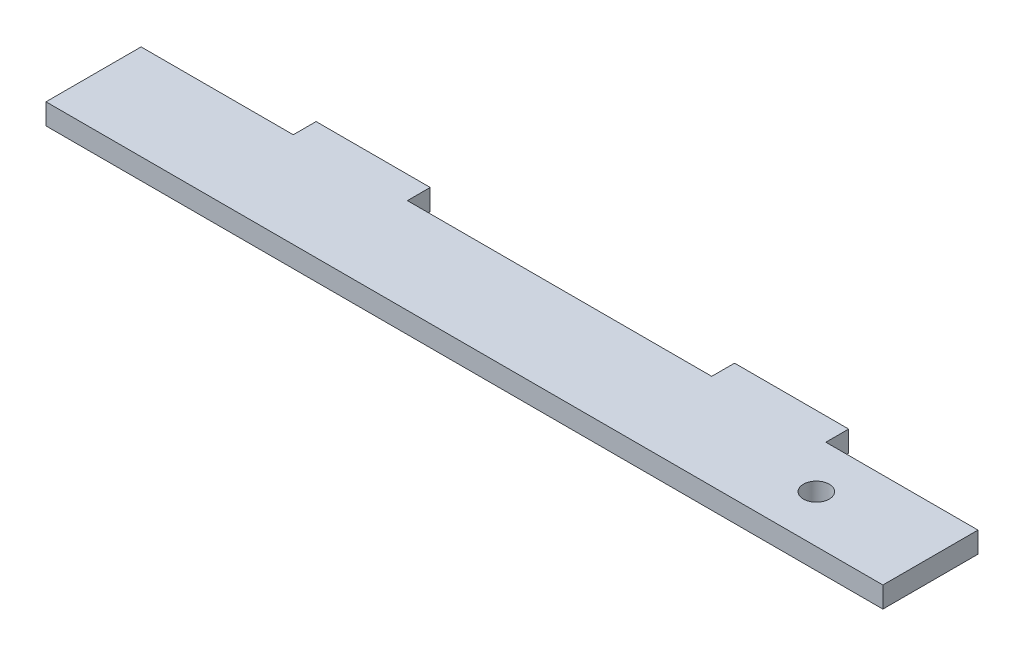
ISO-10303-21;
HEADER;
FILE_DESCRIPTION(('STEP AP214'),'2;1');
FILE_NAME('part.step','',(''),(''),'','','');
FILE_SCHEMA(('AUTOMOTIVE_DESIGN { 1 0 10303 214 1 1 1 1 }'));
ENDSEC;
DATA;
#1=APPLICATION_CONTEXT('core data for automotive mechanical design processes');
#2=APPLICATION_PROTOCOL_DEFINITION('international standard','automotive_design',2000,#1);
#3=PRODUCT_CONTEXT('',#1,'mechanical');
#4=PRODUCT('Part','Part','',(#3));
#5=PRODUCT_RELATED_PRODUCT_CATEGORY('part','',(#4));
#6=PRODUCT_DEFINITION_FORMATION('','',#4);
#7=PRODUCT_DEFINITION_CONTEXT('part definition',#1,'design');
#8=PRODUCT_DEFINITION('design','',#6,#7);
#9=PRODUCT_DEFINITION_SHAPE('','',#8);
#10=(LENGTH_UNIT() NAMED_UNIT(*) SI_UNIT(.MILLI.,.METRE.));
#11=(NAMED_UNIT(*) PLANE_ANGLE_UNIT() SI_UNIT($,.RADIAN.));
#12=(NAMED_UNIT(*) SI_UNIT($,.STERADIAN.) SOLID_ANGLE_UNIT());
#13=UNCERTAINTY_MEASURE_WITH_UNIT(LENGTH_MEASURE(1.E-05),#10,'distance_accuracy_value','');
#14=(GEOMETRIC_REPRESENTATION_CONTEXT(3) GLOBAL_UNCERTAINTY_ASSIGNED_CONTEXT((#13)) GLOBAL_UNIT_ASSIGNED_CONTEXT((#10,
#11,#12)) REPRESENTATION_CONTEXT('',''));
#15=CARTESIAN_POINT('',(0.,0.,0.));
#16=DIRECTION('',(0.,0.,1.));
#17=DIRECTION('',(1.,0.,0.));
#18=AXIS2_PLACEMENT_3D('',#15,#16,#17);
#19=CARTESIAN_POINT('',(-70.,5.5,0.));
#20=DIRECTION('',(-1.,0.,0.));
#21=DIRECTION('',(0.,0.,1.));
#22=AXIS2_PLACEMENT_3D('',#19,#20,#21);
#23=PLANE('',#22);
#24=DIRECTION('',(0.,0.,-1.));
#25=VECTOR('',#24,1.);
#26=CARTESIAN_POINT('',(-70.,0.,0.));
#27=LINE('',#26,#25);
#28=CARTESIAN_POINT('',(-70.,0.,-12.5000000000001));
#29=VERTEX_POINT('',#28);
#30=CARTESIAN_POINT('',(-70.,0.,-18.5000000000001));
#31=VERTEX_POINT('',#30);
#32=EDGE_CURVE('E189',#29,#31,#27,.T.);
#33=ORIENTED_EDGE('',*,*,#32,.F.);
#34=DIRECTION('',(0.,-1.,0.));
#35=VECTOR('',#34,1.);
#36=CARTESIAN_POINT('',(-70.,5.5,-12.5000000000001));
#37=LINE('',#36,#35);
#38=CARTESIAN_POINT('',(-70.,5.5,-12.5000000000001));
#39=VERTEX_POINT('',#38);
#40=EDGE_CURVE('E11',#39,#29,#37,.T.);
#41=ORIENTED_EDGE('',*,*,#40,.F.);
#42=DIRECTION('',(0.,0.,-1.));
#43=VECTOR('',#42,1.);
#44=CARTESIAN_POINT('',(-70.,5.5,0.));
#45=LINE('',#44,#43);
#46=CARTESIAN_POINT('',(-70.,5.5,-18.5000000000001));
#47=VERTEX_POINT('',#46);
#48=EDGE_CURVE('E169',#39,#47,#45,.T.);
#49=ORIENTED_EDGE('',*,*,#48,.T.);
#50=DIRECTION('',(0.,-1.,0.));
#51=VECTOR('',#50,1.);
#52=CARTESIAN_POINT('',(-70.,5.5,-18.5000000000001));
#53=LINE('',#52,#51);
#54=EDGE_CURVE('E55',#47,#31,#53,.T.);
#55=ORIENTED_EDGE('',*,*,#54,.T.);
#56=EDGE_LOOP('',(#33,#41,#49,#55));
#57=FACE_BOUND('',#56,.T.);
#58=ADVANCED_FACE('F38',(#57),#23,.T.);
#59=CARTESIAN_POINT('',(0.,5.5,-12.5000000000001));
#60=DIRECTION('',(0.,0.,-1.));
#61=DIRECTION('',(-1.,0.,0.));
#62=AXIS2_PLACEMENT_3D('',#59,#60,#61);
#63=PLANE('',#62);
#64=DIRECTION('',(1.,0.,0.));
#65=VECTOR('',#64,1.);
#66=CARTESIAN_POINT('',(0.,0.,-12.5000000000001));
#67=LINE('',#66,#65);
#68=CARTESIAN_POINT('',(-110.,0.,-12.5000000000001));
#69=VERTEX_POINT('',#68);
#70=EDGE_CURVE('E193',#69,#29,#67,.T.);
#71=ORIENTED_EDGE('',*,*,#70,.F.);
#72=DIRECTION('',(0.,-1.,0.));
#73=VECTOR('',#72,1.);
#74=CARTESIAN_POINT('',(-110.,5.5,-12.5000000000001));
#75=LINE('',#74,#73);
#76=CARTESIAN_POINT('',(-110.,5.5,-12.5000000000001));
#77=VERTEX_POINT('',#76);
#78=EDGE_CURVE('E47',#77,#69,#75,.T.);
#79=ORIENTED_EDGE('',*,*,#78,.F.);
#80=DIRECTION('',(1.,0.,0.));
#81=VECTOR('',#80,1.);
#82=CARTESIAN_POINT('',(0.,5.5,-12.5000000000001));
#83=LINE('',#82,#81);
#84=EDGE_CURVE('E156',#77,#39,#83,.T.);
#85=ORIENTED_EDGE('',*,*,#84,.T.);
#86=ORIENTED_EDGE('',*,*,#40,.T.);
#87=EDGE_LOOP('',(#71,#79,#85,#86));
#88=FACE_BOUND('',#87,.T.);
#89=ADVANCED_FACE('F257',(#88),#63,.T.);
#90=CARTESIAN_POINT('',(-110.,5.5,0.));
#91=DIRECTION('',(-1.,0.,0.));
#92=DIRECTION('',(0.,0.,1.));
#93=AXIS2_PLACEMENT_3D('',#90,#91,#92);
#94=PLANE('',#93);
#95=DIRECTION('',(0.,0.,-1.));
#96=VECTOR('',#95,1.);
#97=CARTESIAN_POINT('',(-110.,0.,0.));
#98=LINE('',#97,#96);
#99=CARTESIAN_POINT('',(-110.,0.,12.4999999999999));
#100=VERTEX_POINT('',#99);
#101=EDGE_CURVE('E198',#100,#69,#98,.T.);
#102=ORIENTED_EDGE('',*,*,#101,.F.);
#103=DIRECTION('',(0.,-1.,0.));
#104=VECTOR('',#103,1.);
#105=CARTESIAN_POINT('',(-110.,5.5,12.4999999999999));
#106=LINE('',#105,#104);
#107=CARTESIAN_POINT('',(-110.,5.5,12.4999999999999));
#108=VERTEX_POINT('',#107);
#109=EDGE_CURVE('E249',#108,#100,#106,.T.);
#110=ORIENTED_EDGE('',*,*,#109,.F.);
#111=DIRECTION('',(0.,0.,-1.));
#112=VECTOR('',#111,1.);
#113=CARTESIAN_POINT('',(-110.,5.5,0.));
#114=LINE('',#113,#112);
#115=EDGE_CURVE('E168',#108,#77,#114,.T.);
#116=ORIENTED_EDGE('',*,*,#115,.T.);
#117=ORIENTED_EDGE('',*,*,#78,.T.);
#118=EDGE_LOOP('',(#102,#110,#116,#117));
#119=FACE_BOUND('',#118,.T.);
#120=ADVANCED_FACE('F255',(#119),#94,.T.);
#121=CARTESIAN_POINT('',(0.,5.5,12.4999999999999));
#122=DIRECTION('',(0.,0.,-1.));
#123=DIRECTION('',(-1.,0.,0.));
#124=AXIS2_PLACEMENT_3D('',#121,#122,#123);
#125=PLANE('',#124);
#126=DIRECTION('',(1.,0.,0.));
#127=VECTOR('',#126,1.);
#128=CARTESIAN_POINT('',(0.,0.,12.4999999999999));
#129=LINE('',#128,#127);
#130=CARTESIAN_POINT('',(110.000000000001,0.,12.4999999999999));
#131=VERTEX_POINT('',#130);
#132=EDGE_CURVE('E206',#100,#131,#129,.T.);
#133=ORIENTED_EDGE('',*,*,#132,.T.);
#134=DIRECTION('',(0.,-1.,0.));
#135=VECTOR('',#134,1.);
#136=CARTESIAN_POINT('',(110.000000000001,5.5,12.4999999999999));
#137=LINE('',#136,#135);
#138=CARTESIAN_POINT('',(110.000000000001,5.5,12.4999999999999));
#139=VERTEX_POINT('',#138);
#140=EDGE_CURVE('E245',#139,#131,#137,.T.);
#141=ORIENTED_EDGE('',*,*,#140,.F.);
#142=DIRECTION('',(1.,0.,0.));
#143=VECTOR('',#142,1.);
#144=CARTESIAN_POINT('',(0.,5.5,12.4999999999999));
#145=LINE('',#144,#143);
#146=EDGE_CURVE('E175',#108,#139,#145,.T.);
#147=ORIENTED_EDGE('',*,*,#146,.F.);
#148=ORIENTED_EDGE('',*,*,#109,.T.);
#149=EDGE_LOOP('',(#133,#141,#147,#148));
#150=FACE_BOUND('',#149,.T.);
#151=ADVANCED_FACE('F264',(#150),#125,.F.);
#152=CARTESIAN_POINT('',(110.000000000001,5.5,0.));
#153=DIRECTION('',(-1.,0.,0.));
#154=DIRECTION('',(0.,0.,1.));
#155=AXIS2_PLACEMENT_3D('',#152,#153,#154);
#156=PLANE('',#155);
#157=DIRECTION('',(0.,0.,-1.));
#158=VECTOR('',#157,1.);
#159=CARTESIAN_POINT('',(110.000000000001,0.,0.));
#160=LINE('',#159,#158);
#161=CARTESIAN_POINT('',(110.000000000001,0.,-12.5000000000001));
#162=VERTEX_POINT('',#161);
#163=EDGE_CURVE('E209',#131,#162,#160,.T.);
#164=ORIENTED_EDGE('',*,*,#163,.T.);
#165=DIRECTION('',(0.,-1.,0.));
#166=VECTOR('',#165,1.);
#167=CARTESIAN_POINT('',(110.000000000001,5.5,-12.5000000000001));
#168=LINE('',#167,#166);
#169=CARTESIAN_POINT('',(110.000000000001,5.5,-12.5000000000001));
#170=VERTEX_POINT('',#169);
#171=EDGE_CURVE('E242',#170,#162,#168,.T.);
#172=ORIENTED_EDGE('',*,*,#171,.F.);
#173=DIRECTION('',(0.,0.,-1.));
#174=VECTOR('',#173,1.);
#175=CARTESIAN_POINT('',(110.000000000001,5.5,0.));
#176=LINE('',#175,#174);
#177=EDGE_CURVE('E165',#139,#170,#176,.T.);
#178=ORIENTED_EDGE('',*,*,#177,.F.);
#179=ORIENTED_EDGE('',*,*,#140,.T.);
#180=EDGE_LOOP('',(#164,#172,#178,#179));
#181=FACE_BOUND('',#180,.T.);
#182=ADVANCED_FACE('F268',(#181),#156,.F.);
#183=CARTESIAN_POINT('',(70.,0.,-12.5000000000001));
#184=VERTEX_POINT('',#183);
#185=EDGE_CURVE('E200',#184,#162,#67,.T.);
#186=ORIENTED_EDGE('',*,*,#185,.F.);
#187=DIRECTION('',(0.,-1.,0.));
#188=VECTOR('',#187,1.);
#189=CARTESIAN_POINT('',(70.,5.5,-12.5000000000001));
#190=LINE('',#189,#188);
#191=CARTESIAN_POINT('',(70.,5.5,-12.5000000000001));
#192=VERTEX_POINT('',#191);
#193=EDGE_CURVE('E239',#192,#184,#190,.T.);
#194=ORIENTED_EDGE('',*,*,#193,.F.);
#195=EDGE_CURVE('E155',#192,#170,#83,.T.);
#196=ORIENTED_EDGE('',*,*,#195,.T.);
#197=ORIENTED_EDGE('',*,*,#171,.T.);
#198=EDGE_LOOP('',(#186,#194,#196,#197));
#199=FACE_BOUND('',#198,.T.);
#200=ADVANCED_FACE('F294',(#199),#63,.T.);
#201=CARTESIAN_POINT('',(70.,5.5,0.));
#202=DIRECTION('',(-1.,0.,0.));
#203=DIRECTION('',(0.,0.,1.));
#204=AXIS2_PLACEMENT_3D('',#201,#202,#203);
#205=PLANE('',#204);
#206=DIRECTION('',(0.,0.,-1.));
#207=VECTOR('',#206,1.);
#208=CARTESIAN_POINT('',(70.,0.,0.));
#209=LINE('',#208,#207);
#210=CARTESIAN_POINT('',(70.,0.,-18.5000000000001));
#211=VERTEX_POINT('',#210);
#212=EDGE_CURVE('E213',#184,#211,#209,.T.);
#213=ORIENTED_EDGE('',*,*,#212,.T.);
#214=DIRECTION('',(0.,-1.,0.));
#215=VECTOR('',#214,1.);
#216=CARTESIAN_POINT('',(70.,5.5,-18.5000000000001));
#217=LINE('',#216,#215);
#218=CARTESIAN_POINT('',(70.,5.5,-18.5000000000001));
#219=VERTEX_POINT('',#218);
#220=EDGE_CURVE('E235',#219,#211,#217,.T.);
#221=ORIENTED_EDGE('',*,*,#220,.F.);
#222=DIRECTION('',(0.,0.,-1.));
#223=VECTOR('',#222,1.);
#224=CARTESIAN_POINT('',(70.,5.5,0.));
#225=LINE('',#224,#223);
#226=EDGE_CURVE('E164',#192,#219,#225,.T.);
#227=ORIENTED_EDGE('',*,*,#226,.F.);
#228=ORIENTED_EDGE('',*,*,#193,.T.);
#229=EDGE_LOOP('',(#213,#221,#227,#228));
#230=FACE_BOUND('',#229,.T.);
#231=ADVANCED_FACE('F296',(#230),#205,.F.);
#232=CARTESIAN_POINT('',(0.,5.5,-18.5000000000001));
#233=DIRECTION('',(0.,0.,1.));
#234=DIRECTION('',(1.,0.,0.));
#235=AXIS2_PLACEMENT_3D('',#232,#233,#234);
#236=PLANE('',#235);
#237=DIRECTION('',(-1.,0.,0.));
#238=VECTOR('',#237,1.);
#239=CARTESIAN_POINT('',(0.,0.,-18.5000000000001));
#240=LINE('',#239,#238);
#241=CARTESIAN_POINT('',(40.,0.,-18.5000000000001));
#242=VERTEX_POINT('',#241);
#243=EDGE_CURVE('E216',#211,#242,#240,.T.);
#244=ORIENTED_EDGE('',*,*,#243,.T.);
#245=DIRECTION('',(0.,-1.,0.));
#246=VECTOR('',#245,1.);
#247=CARTESIAN_POINT('',(40.,5.5,-18.5000000000001));
#248=LINE('',#247,#246);
#249=CARTESIAN_POINT('',(40.,5.5,-18.5000000000001));
#250=VERTEX_POINT('',#249);
#251=EDGE_CURVE('E232',#250,#242,#248,.T.);
#252=ORIENTED_EDGE('',*,*,#251,.F.);
#253=DIRECTION('',(-1.,0.,0.));
#254=VECTOR('',#253,1.);
#255=CARTESIAN_POINT('',(0.,5.5,-18.5000000000001));
#256=LINE('',#255,#254);
#257=EDGE_CURVE('E158',#219,#250,#256,.T.);
#258=ORIENTED_EDGE('',*,*,#257,.F.);
#259=ORIENTED_EDGE('',*,*,#220,.T.);
#260=EDGE_LOOP('',(#244,#252,#258,#259));
#261=FACE_BOUND('',#260,.T.);
#262=ADVANCED_FACE('F284',(#261),#236,.F.);
#263=CARTESIAN_POINT('',(40.,5.5,0.));
#264=DIRECTION('',(-1.,0.,0.));
#265=DIRECTION('',(0.,0.,1.));
#266=AXIS2_PLACEMENT_3D('',#263,#264,#265);
#267=PLANE('',#266);
#268=DIRECTION('',(0.,0.,-1.));
#269=VECTOR('',#268,1.);
#270=CARTESIAN_POINT('',(40.,0.,0.));
#271=LINE('',#270,#269);
#272=CARTESIAN_POINT('',(40.,0.,-12.5000000000001));
#273=VERTEX_POINT('',#272);
#274=EDGE_CURVE('E220',#273,#242,#271,.T.);
#275=ORIENTED_EDGE('',*,*,#274,.F.);
#276=DIRECTION('',(0.,-1.,0.));
#277=VECTOR('',#276,1.);
#278=CARTESIAN_POINT('',(40.,5.5,-12.5000000000001));
#279=LINE('',#278,#277);
#280=CARTESIAN_POINT('',(40.,5.5,-12.5000000000001));
#281=VERTEX_POINT('',#280);
#282=EDGE_CURVE('E140',#281,#273,#279,.T.);
#283=ORIENTED_EDGE('',*,*,#282,.F.);
#284=DIRECTION('',(0.,0.,-1.));
#285=VECTOR('',#284,1.);
#286=CARTESIAN_POINT('',(40.,5.5,0.));
#287=LINE('',#286,#285);
#288=EDGE_CURVE('E152',#281,#250,#287,.T.);
#289=ORIENTED_EDGE('',*,*,#288,.T.);
#290=ORIENTED_EDGE('',*,*,#251,.T.);
#291=EDGE_LOOP('',(#275,#283,#289,#290));
#292=FACE_BOUND('',#291,.T.);
#293=ADVANCED_FACE('F288',(#292),#267,.T.);
#294=CARTESIAN_POINT('',(-40.,0.,-12.5000000000001));
#295=VERTEX_POINT('',#294);
#296=EDGE_CURVE('E136',#295,#273,#67,.T.);
#297=ORIENTED_EDGE('',*,*,#296,.F.);
#298=DIRECTION('',(0.,-1.,0.));
#299=VECTOR('',#298,1.);
#300=CARTESIAN_POINT('',(-40.,5.5,-12.5000000000001));
#301=LINE('',#300,#299);
#302=CARTESIAN_POINT('',(-40.,5.5,-12.5000000000001));
#303=VERTEX_POINT('',#302);
#304=EDGE_CURVE('E130',#303,#295,#301,.T.);
#305=ORIENTED_EDGE('',*,*,#304,.F.);
#306=EDGE_CURVE('E134',#303,#281,#83,.T.);
#307=ORIENTED_EDGE('',*,*,#306,.T.);
#308=ORIENTED_EDGE('',*,*,#282,.T.);
#309=EDGE_LOOP('',(#297,#305,#307,#308));
#310=FACE_BOUND('',#309,.T.);
#311=ADVANCED_FACE('F132',(#310),#63,.T.);
#312=CARTESIAN_POINT('',(-40.,5.5,0.));
#313=DIRECTION('',(-1.,0.,0.));
#314=DIRECTION('',(0.,0.,1.));
#315=AXIS2_PLACEMENT_3D('',#312,#313,#314);
#316=PLANE('',#315);
#317=DIRECTION('',(0.,0.,-1.));
#318=VECTOR('',#317,1.);
#319=CARTESIAN_POINT('',(-40.,0.,0.));
#320=LINE('',#319,#318);
#321=CARTESIAN_POINT('',(-40.,0.,-18.5000000000001));
#322=VERTEX_POINT('',#321);
#323=EDGE_CURVE('E179',#295,#322,#320,.T.);
#324=ORIENTED_EDGE('',*,*,#323,.T.);
#325=DIRECTION('',(0.,-1.,0.));
#326=VECTOR('',#325,1.);
#327=CARTESIAN_POINT('',(-40.,5.5,-18.5000000000001));
#328=LINE('',#327,#326);
#329=CARTESIAN_POINT('',(-40.,5.5,-18.5000000000001));
#330=VERTEX_POINT('',#329);
#331=EDGE_CURVE('E93',#330,#322,#328,.T.);
#332=ORIENTED_EDGE('',*,*,#331,.F.);
#333=DIRECTION('',(0.,0.,-1.));
#334=VECTOR('',#333,1.);
#335=CARTESIAN_POINT('',(-40.,5.5,0.));
#336=LINE('',#335,#334);
#337=EDGE_CURVE('E142',#303,#330,#336,.T.);
#338=ORIENTED_EDGE('',*,*,#337,.F.);
#339=ORIENTED_EDGE('',*,*,#304,.T.);
#340=EDGE_LOOP('',(#324,#332,#338,#339));
#341=FACE_BOUND('',#340,.T.);
#342=ADVANCED_FACE('F143',(#341),#316,.F.);
#343=CARTESIAN_POINT('',(0.,5.5,-18.5000000000001));
#344=DIRECTION('',(0.,0.,-1.));
#345=DIRECTION('',(-1.,0.,0.));
#346=AXIS2_PLACEMENT_3D('',#343,#344,#345);
#347=PLANE('',#346);
#348=DIRECTION('',(1.,0.,0.));
#349=VECTOR('',#348,1.);
#350=CARTESIAN_POINT('',(0.,0.,-18.5000000000001));
#351=LINE('',#350,#349);
#352=EDGE_CURVE('E176',#31,#322,#351,.T.);
#353=ORIENTED_EDGE('',*,*,#352,.F.);
#354=ORIENTED_EDGE('',*,*,#54,.F.);
#355=DIRECTION('',(1.,0.,0.));
#356=VECTOR('',#355,1.);
#357=CARTESIAN_POINT('',(0.,5.5,-18.5000000000001));
#358=LINE('',#357,#356);
#359=EDGE_CURVE('E147',#47,#330,#358,.T.);
#360=ORIENTED_EDGE('',*,*,#359,.T.);
#361=ORIENTED_EDGE('',*,*,#331,.T.);
#362=EDGE_LOOP('',(#353,#354,#360,#361));
#363=FACE_BOUND('',#362,.T.);
#364=ADVANCED_FACE('F320',(#363),#347,.T.);
#365=CARTESIAN_POINT('',(0.,5.5,0.));
#366=DIRECTION('',(0.,1.,0.));
#367=DIRECTION('',(0.,0.,1.));
#368=AXIS2_PLACEMENT_3D('',#365,#366,#367);
#369=PLANE('',#368);
#370=CARTESIAN_POINT('',(80.0000000000005,5.5,0.));
#371=DIRECTION('',(0.,1.,0.));
#372=DIRECTION('',(0.,0.,1.));
#373=AXIS2_PLACEMENT_3D('',#370,#371,#372);
#374=CIRCLE('',#373,3.4);
#375=CARTESIAN_POINT('',(80.0000000000005,5.5,3.4));
#376=VERTEX_POINT('',#375);
#377=EDGE_CURVE('E182',#376,#376,#374,.T.);
#378=ORIENTED_EDGE('',*,*,#377,.F.);
#379=EDGE_LOOP('',(#378));
#380=FACE_BOUND('',#379,.T.);
#381=ORIENTED_EDGE('',*,*,#48,.F.);
#382=ORIENTED_EDGE('',*,*,#84,.F.);
#383=ORIENTED_EDGE('',*,*,#115,.F.);
#384=ORIENTED_EDGE('',*,*,#146,.T.);
#385=ORIENTED_EDGE('',*,*,#177,.T.);
#386=ORIENTED_EDGE('',*,*,#195,.F.);
#387=ORIENTED_EDGE('',*,*,#226,.T.);
#388=ORIENTED_EDGE('',*,*,#257,.T.);
#389=ORIENTED_EDGE('',*,*,#288,.F.);
#390=ORIENTED_EDGE('',*,*,#306,.F.);
#391=ORIENTED_EDGE('',*,*,#337,.T.);
#392=ORIENTED_EDGE('',*,*,#359,.F.);
#393=EDGE_LOOP('',(#381,#382,#383,#384,#385,#386,#387,#388,#389,#390,#391,#392));
#394=FACE_BOUND('',#393,.T.);
#395=ADVANCED_FACE('F150',(#380,#394),#369,.T.);
#396=CARTESIAN_POINT('',(0.,0.,0.));
#397=DIRECTION('',(0.,1.,0.));
#398=DIRECTION('',(0.,0.,1.));
#399=AXIS2_PLACEMENT_3D('',#396,#397,#398);
#400=PLANE('',#399);
#401=CARTESIAN_POINT('',(80.0000000000005,0.,0.));
#402=DIRECTION('',(0.,1.,0.));
#403=DIRECTION('',(0.,0.,1.));
#404=AXIS2_PLACEMENT_3D('',#401,#402,#403);
#405=CIRCLE('',#404,3.4);
#406=CARTESIAN_POINT('',(80.0000000000005,0.,3.4));
#407=VERTEX_POINT('',#406);
#408=EDGE_CURVE('E186',#407,#407,#405,.T.);
#409=ORIENTED_EDGE('',*,*,#408,.T.);
#410=EDGE_LOOP('',(#409));
#411=FACE_BOUND('',#410,.T.);
#412=ORIENTED_EDGE('',*,*,#32,.T.);
#413=ORIENTED_EDGE('',*,*,#352,.T.);
#414=ORIENTED_EDGE('',*,*,#323,.F.);
#415=ORIENTED_EDGE('',*,*,#296,.T.);
#416=ORIENTED_EDGE('',*,*,#274,.T.);
#417=ORIENTED_EDGE('',*,*,#243,.F.);
#418=ORIENTED_EDGE('',*,*,#212,.F.);
#419=ORIENTED_EDGE('',*,*,#185,.T.);
#420=ORIENTED_EDGE('',*,*,#163,.F.);
#421=ORIENTED_EDGE('',*,*,#132,.F.);
#422=ORIENTED_EDGE('',*,*,#101,.T.);
#423=ORIENTED_EDGE('',*,*,#70,.T.);
#424=EDGE_LOOP('',(#412,#413,#414,#415,#416,#417,#418,#419,#420,#421,#422,#423));
#425=FACE_BOUND('',#424,.T.);
#426=ADVANCED_FACE('F259',(#411,#425),#400,.F.);
#427=CARTESIAN_POINT('',(80.0000000000005,0.,0.));
#428=DIRECTION('',(0.,1.,0.));
#429=DIRECTION('',(0.,0.,1.));
#430=AXIS2_PLACEMENT_3D('',#427,#428,#429);
#431=CYLINDRICAL_SURFACE('',#430,3.4);
#432=ORIENTED_EDGE('',*,*,#408,.F.);
#433=EDGE_LOOP('',(#432));
#434=FACE_BOUND('',#433,.T.);
#435=ORIENTED_EDGE('',*,*,#377,.T.);
#436=EDGE_LOOP('',(#435));
#437=FACE_BOUND('',#436,.T.);
#438=ADVANCED_FACE('F417',(#434,#437),#431,.F.);
#439=CLOSED_SHELL('',(#58,#89,#120,#151,#182,#200,#231,#262,#293,#311,#342,#364,#395,#426,#438));
#440=MANIFOLD_SOLID_BREP('B2',#439);
#441=ADVANCED_BREP_SHAPE_REPRESENTATION('',(#18,#440),#14);
#442=SHAPE_DEFINITION_REPRESENTATION(#9,#441);
ENDSEC;
END-ISO-10303-21;
